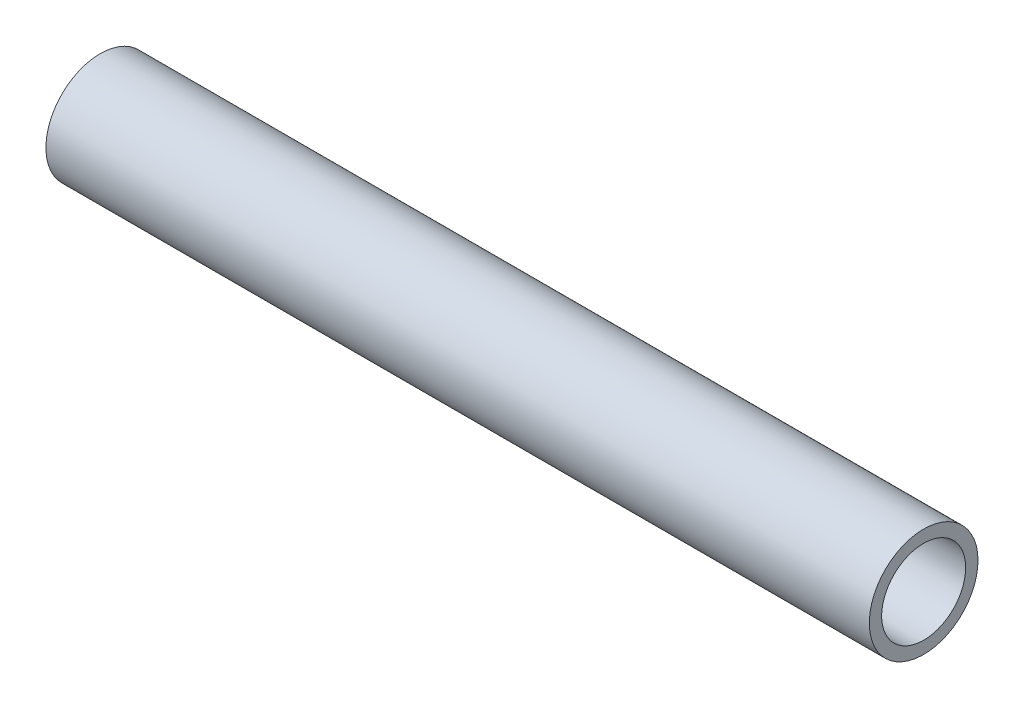
ISO-10303-21;
HEADER;
FILE_DESCRIPTION(('STEP AP214'),'2;1');
FILE_NAME('part.step','',(''),(''),'','','');
FILE_SCHEMA(('AUTOMOTIVE_DESIGN { 1 0 10303 214 1 1 1 1 }'));
ENDSEC;
DATA;
#1=APPLICATION_CONTEXT('core data for automotive mechanical design processes');
#2=APPLICATION_PROTOCOL_DEFINITION('international standard','automotive_design',2000,#1);
#3=PRODUCT_CONTEXT('',#1,'mechanical');
#4=PRODUCT('Part','Part','',(#3));
#5=PRODUCT_RELATED_PRODUCT_CATEGORY('part','',(#4));
#6=PRODUCT_DEFINITION_FORMATION('','',#4);
#7=PRODUCT_DEFINITION_CONTEXT('part definition',#1,'design');
#8=PRODUCT_DEFINITION('design','',#6,#7);
#9=PRODUCT_DEFINITION_SHAPE('','',#8);
#10=(LENGTH_UNIT() NAMED_UNIT(*) SI_UNIT(.MILLI.,.METRE.));
#11=(NAMED_UNIT(*) PLANE_ANGLE_UNIT() SI_UNIT($,.RADIAN.));
#12=(NAMED_UNIT(*) SI_UNIT($,.STERADIAN.) SOLID_ANGLE_UNIT());
#13=UNCERTAINTY_MEASURE_WITH_UNIT(LENGTH_MEASURE(1.E-05),#10,'distance_accuracy_value','');
#14=(GEOMETRIC_REPRESENTATION_CONTEXT(3) GLOBAL_UNCERTAINTY_ASSIGNED_CONTEXT((#13)) GLOBAL_UNIT_ASSIGNED_CONTEXT((#10,
#11,#12)) REPRESENTATION_CONTEXT('',''));
#15=CARTESIAN_POINT('',(0.,0.,0.));
#16=DIRECTION('',(0.,0.,1.));
#17=DIRECTION('',(1.,0.,0.));
#18=AXIS2_PLACEMENT_3D('',#15,#16,#17);
#19=CARTESIAN_POINT('',(100.,0.,0.));
#20=DIRECTION('',(1.,0.,0.));
#21=DIRECTION('',(0.,0.,-1.));
#22=AXIS2_PLACEMENT_3D('',#19,#20,#21);
#23=PLANE('',#22);
#24=CARTESIAN_POINT('',(100.,0.,0.));
#25=DIRECTION('',(1.,0.,0.));
#26=DIRECTION('',(0.,0.,-1.));
#27=AXIS2_PLACEMENT_3D('',#24,#25,#26);
#28=CIRCLE('',#27,6.6);
#29=CARTESIAN_POINT('',(100.,0.,-6.6));
#30=VERTEX_POINT('',#29);
#31=EDGE_CURVE('E10',#30,#30,#28,.T.);
#32=ORIENTED_EDGE('',*,*,#31,.T.);
#33=EDGE_LOOP('',(#32));
#34=FACE_BOUND('',#33,.T.);
#35=CARTESIAN_POINT('',(100.,0.,0.));
#36=DIRECTION('',(1.,0.,0.));
#37=DIRECTION('',(0.,0.,-1.));
#38=AXIS2_PLACEMENT_3D('',#35,#36,#37);
#39=CIRCLE('',#38,5.1);
#40=CARTESIAN_POINT('',(100.,0.,-5.1));
#41=VERTEX_POINT('',#40);
#42=EDGE_CURVE('E48',#41,#41,#39,.T.);
#43=ORIENTED_EDGE('',*,*,#42,.F.);
#44=EDGE_LOOP('',(#43));
#45=FACE_BOUND('',#44,.T.);
#46=ADVANCED_FACE('F37',(#34,#45),#23,.T.);
#47=CARTESIAN_POINT('',(0.,0.,0.));
#48=DIRECTION('',(1.,0.,0.));
#49=DIRECTION('',(0.,0.,-1.));
#50=AXIS2_PLACEMENT_3D('',#47,#48,#49);
#51=PLANE('',#50);
#52=CARTESIAN_POINT('',(0.,0.,0.));
#53=DIRECTION('',(1.,0.,0.));
#54=DIRECTION('',(0.,0.,-1.));
#55=AXIS2_PLACEMENT_3D('',#52,#53,#54);
#56=CIRCLE('',#55,6.6);
#57=CARTESIAN_POINT('',(0.,0.,-6.6));
#58=VERTEX_POINT('',#57);
#59=EDGE_CURVE('E41',#58,#58,#56,.T.);
#60=ORIENTED_EDGE('',*,*,#59,.F.);
#61=EDGE_LOOP('',(#60));
#62=FACE_BOUND('',#61,.T.);
#63=CARTESIAN_POINT('',(0.,0.,0.));
#64=DIRECTION('',(1.,0.,0.));
#65=DIRECTION('',(0.,0.,-1.));
#66=AXIS2_PLACEMENT_3D('',#63,#64,#65);
#67=CIRCLE('',#66,5.1);
#68=CARTESIAN_POINT('',(0.,0.,-5.1));
#69=VERTEX_POINT('',#68);
#70=EDGE_CURVE('E50',#69,#69,#67,.T.);
#71=ORIENTED_EDGE('',*,*,#70,.T.);
#72=EDGE_LOOP('',(#71));
#73=FACE_BOUND('',#72,.T.);
#74=ADVANCED_FACE('F60',(#62,#73),#51,.F.);
#75=CARTESIAN_POINT('',(100.,0.,0.));
#76=DIRECTION('',(-1.,0.,0.));
#77=DIRECTION('',(0.,0.,1.));
#78=AXIS2_PLACEMENT_3D('',#75,#76,#77);
#79=CYLINDRICAL_SURFACE('',#78,6.6);
#80=ORIENTED_EDGE('',*,*,#31,.F.);
#81=EDGE_LOOP('',(#80));
#82=FACE_BOUND('',#81,.T.);
#83=ORIENTED_EDGE('',*,*,#59,.T.);
#84=EDGE_LOOP('',(#83));
#85=FACE_BOUND('',#84,.T.);
#86=ADVANCED_FACE('F39',(#82,#85),#79,.T.);
#87=CARTESIAN_POINT('',(100.,0.,0.));
#88=DIRECTION('',(-1.,0.,0.));
#89=DIRECTION('',(0.,0.,1.));
#90=AXIS2_PLACEMENT_3D('',#87,#88,#89);
#91=CYLINDRICAL_SURFACE('',#90,5.1);
#92=ORIENTED_EDGE('',*,*,#42,.T.);
#93=EDGE_LOOP('',(#92));
#94=FACE_BOUND('',#93,.T.);
#95=ORIENTED_EDGE('',*,*,#70,.F.);
#96=EDGE_LOOP('',(#95));
#97=FACE_BOUND('',#96,.T.);
#98=ADVANCED_FACE('F56',(#94,#97),#91,.F.);
#99=CLOSED_SHELL('',(#46,#74,#86,#98));
#100=MANIFOLD_SOLID_BREP('B2',#99);
#101=ADVANCED_BREP_SHAPE_REPRESENTATION('',(#18,#100),#14);
#102=SHAPE_DEFINITION_REPRESENTATION(#9,#101);
ENDSEC;
END-ISO-10303-21;
